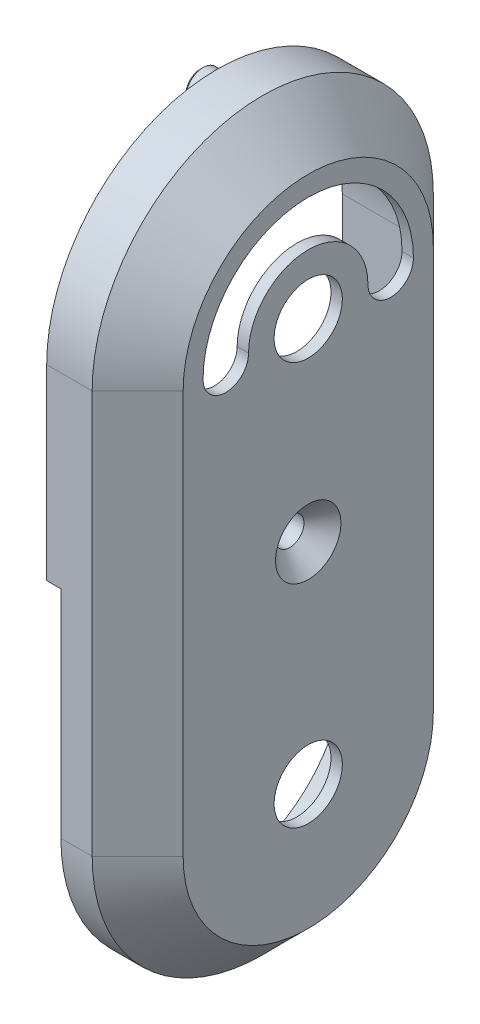
ISO-10303-21;
HEADER;
FILE_DESCRIPTION(('STEP AP214'),'2;1');
FILE_NAME('part.step','',(''),(''),'','','');
FILE_SCHEMA(('AUTOMOTIVE_DESIGN { 1 0 10303 214 1 1 1 1 }'));
ENDSEC;
DATA;
#1=APPLICATION_CONTEXT('core data for automotive mechanical design processes');
#2=APPLICATION_PROTOCOL_DEFINITION('international standard','automotive_design',2000,#1);
#3=PRODUCT_CONTEXT('',#1,'mechanical');
#4=PRODUCT('Part','Part','',(#3));
#5=PRODUCT_RELATED_PRODUCT_CATEGORY('part','',(#4));
#6=PRODUCT_DEFINITION_FORMATION('','',#4);
#7=PRODUCT_DEFINITION_CONTEXT('part definition',#1,'design');
#8=PRODUCT_DEFINITION('design','',#6,#7);
#9=PRODUCT_DEFINITION_SHAPE('','',#8);
#10=(LENGTH_UNIT() NAMED_UNIT(*) SI_UNIT(.MILLI.,.METRE.));
#11=(NAMED_UNIT(*) PLANE_ANGLE_UNIT() SI_UNIT($,.RADIAN.));
#12=(NAMED_UNIT(*) SI_UNIT($,.STERADIAN.) SOLID_ANGLE_UNIT());
#13=UNCERTAINTY_MEASURE_WITH_UNIT(LENGTH_MEASURE(1.E-05),#10,'distance_accuracy_value','');
#14=(GEOMETRIC_REPRESENTATION_CONTEXT(3) GLOBAL_UNCERTAINTY_ASSIGNED_CONTEXT((#13)) GLOBAL_UNIT_ASSIGNED_CONTEXT((#10,
#11,#12)) REPRESENTATION_CONTEXT('',''));
#15=CARTESIAN_POINT('',(0.,0.,0.));
#16=DIRECTION('',(0.,0.,1.));
#17=DIRECTION('',(1.,0.,0.));
#18=AXIS2_PLACEMENT_3D('',#15,#16,#17);
#19=CARTESIAN_POINT('',(22.75,21.4944371013356,49.5));
#20=DIRECTION('',(-0.707106781186546,0.,0.707106781186549));
#21=DIRECTION('',(0.,1.,0.));
#22=AXIS2_PLACEMENT_3D('',#19,#20,#21);
#23=PLANE('',#22);
#24=DIRECTION('',(0.,-1.,0.));
#25=VECTOR('',#24,1.);
#26=CARTESIAN_POINT('',(22.25,21.4944371013356,49.));
#27=LINE('',#26,#25);
#28=CARTESIAN_POINT('',(22.25,-9.48074103959939,49.));
#29=VERTEX_POINT('',#28);
#30=CARTESIAN_POINT('',(22.25,-27.4807410395994,49.));
#31=VERTEX_POINT('',#30);
#32=EDGE_CURVE('E531',#29,#31,#27,.T.);
#33=ORIENTED_EDGE('',*,*,#32,.T.);
#34=DIRECTION('',(0.707106781186552,0.,0.707106781186543));
#35=VECTOR('',#34,1.);
#36=CARTESIAN_POINT('',(22.25,-27.4807410395994,49.));
#37=LINE('',#36,#35);
#38=CARTESIAN_POINT('',(23.25,-27.4807410395994,50.));
#39=VERTEX_POINT('',#38);
#40=EDGE_CURVE('E11',#31,#39,#37,.T.);
#41=ORIENTED_EDGE('',*,*,#40,.T.);
#42=DIRECTION('',(0.,1.,0.));
#43=VECTOR('',#42,1.);
#44=CARTESIAN_POINT('',(23.25,45.7320261718032,50.));
#45=LINE('',#44,#43);
#46=CARTESIAN_POINT('',(23.25,-8.4807410395994,50.));
#47=VERTEX_POINT('',#46);
#48=EDGE_CURVE('E462',#39,#47,#45,.T.);
#49=ORIENTED_EDGE('',*,*,#48,.T.);
#50=DIRECTION('',(-0.577350269189628,-0.577350269189624,-0.577350269189625));
#51=VECTOR('',#50,1.);
#52=CARTESIAN_POINT('',(23.7041963568225,-8.02654468277692,50.4541963568225));
#53=LINE('',#52,#51);
#54=EDGE_CURVE('E383',#47,#29,#53,.T.);
#55=ORIENTED_EDGE('',*,*,#54,.T.);
#56=EDGE_LOOP('',(#33,#41,#49,#55));
#57=FACE_BOUND('',#56,.T.);
#58=ADVANCED_FACE('F51',(#57),#23,.T.);
#59=CARTESIAN_POINT('',(22.75,-27.4807410395994,35.));
#60=DIRECTION('',(1.,0.,0.));
#61=DIRECTION('',(0.,-1.,0.));
#62=AXIS2_PLACEMENT_3D('',#59,#60,#61);
#63=CONICAL_SURFACE('',#62,14.5,0.785398163397446);
#64=DIRECTION('',(0.707106781186549,0.,-0.707106781186546));
#65=VECTOR('',#64,1.);
#66=CARTESIAN_POINT('',(22.25,-27.4807410395994,21.));
#67=LINE('',#66,#65);
#68=CARTESIAN_POINT('',(22.25,-27.4807410395994,21.));
#69=VERTEX_POINT('',#68);
#70=CARTESIAN_POINT('',(23.25,-27.4807410395994,20.));
#71=VERTEX_POINT('',#70);
#72=EDGE_CURVE('E58',#69,#71,#67,.T.);
#73=ORIENTED_EDGE('',*,*,#72,.T.);
#74=CARTESIAN_POINT('',(23.25,-27.4807410395994,35.));
#75=DIRECTION('',(-1.,0.,0.));
#76=DIRECTION('',(0.,-1.,0.));
#77=AXIS2_PLACEMENT_3D('',#74,#75,#76);
#78=CIRCLE('',#77,15.);
#79=EDGE_CURVE('E516',#71,#39,#78,.T.);
#80=ORIENTED_EDGE('',*,*,#79,.T.);
#81=ORIENTED_EDGE('',*,*,#40,.F.);
#82=CARTESIAN_POINT('',(22.25,-27.4807410395994,35.));
#83=DIRECTION('',(1.,0.,0.));
#84=DIRECTION('',(0.,-1.,0.));
#85=AXIS2_PLACEMENT_3D('',#82,#83,#84);
#86=CIRCLE('',#85,14.);
#87=EDGE_CURVE('E533',#31,#69,#86,.T.);
#88=ORIENTED_EDGE('',*,*,#87,.T.);
#89=EDGE_LOOP('',(#73,#80,#81,#88));
#90=FACE_BOUND('',#89,.T.);
#91=ADVANCED_FACE('F52',(#90),#63,.T.);
#92=CARTESIAN_POINT('',(22.75,-27.2307410395994,20.5));
#93=DIRECTION('',(-0.707106781186548,0.,-0.707106781186548));
#94=DIRECTION('',(-0.707106781186548,0.,0.707106781186548));
#95=AXIS2_PLACEMENT_3D('',#92,#93,#94);
#96=PLANE('',#95);
#97=DIRECTION('',(0.,-1.,0.));
#98=VECTOR('',#97,1.);
#99=CARTESIAN_POINT('',(23.25,-27.3557410395994,20.));
#100=LINE('',#99,#98);
#101=CARTESIAN_POINT('',(23.25,-8.48074103959941,20.));
#102=VERTEX_POINT('',#101);
#103=EDGE_CURVE('E484',#102,#71,#100,.T.);
#104=ORIENTED_EDGE('',*,*,#103,.T.);
#105=ORIENTED_EDGE('',*,*,#72,.F.);
#106=DIRECTION('',(0.,1.,0.));
#107=VECTOR('',#106,1.);
#108=CARTESIAN_POINT('',(22.25,-27.2307410395994,21.));
#109=LINE('',#108,#107);
#110=CARTESIAN_POINT('',(22.25,-9.48074103959942,21.));
#111=VERTEX_POINT('',#110);
#112=EDGE_CURVE('E526',#69,#111,#109,.T.);
#113=ORIENTED_EDGE('',*,*,#112,.T.);
#114=DIRECTION('',(-0.577350269189626,-0.577350269189625,0.577350269189626));
#115=VECTOR('',#114,1.);
#116=CARTESIAN_POINT('',(15.5833333333333,-16.1474077062661,27.6666666666667));
#117=LINE('',#116,#115);
#118=EDGE_CURVE('E497',#102,#111,#117,.T.);
#119=ORIENTED_EDGE('',*,*,#118,.F.);
#120=EDGE_LOOP('',(#104,#105,#113,#119));
#121=FACE_BOUND('',#120,.T.);
#122=ADVANCED_FACE('F677',(#121),#96,.T.);
#123=CARTESIAN_POINT('',(22.25,-26.9807410395994,35.));
#124=DIRECTION('',(1.,0.,0.));
#125=DIRECTION('',(0.,1.,0.));
#126=AXIS2_PLACEMENT_3D('',#123,#124,#125);
#127=PLANE('',#126);
#128=DIRECTION('',(0.,1.,0.));
#129=VECTOR('',#128,1.);
#130=CARTESIAN_POINT('',(22.25,-27.2307410395994,24.));
#131=LINE('',#130,#129);
#132=CARTESIAN_POINT('',(22.25,-27.4807410395994,24.));
#133=VERTEX_POINT('',#132);
#134=CARTESIAN_POINT('',(22.25,-11.4807410395994,24.));
#135=VERTEX_POINT('',#134);
#136=EDGE_CURVE('E408',#133,#135,#131,.T.);
#137=ORIENTED_EDGE('',*,*,#136,.T.);
#138=DIRECTION('',(0.,0.,1.));
#139=VECTOR('',#138,1.);
#140=CARTESIAN_POINT('',(22.25,-11.4807410395994,50.));
#141=LINE('',#140,#139);
#142=CARTESIAN_POINT('',(22.25,-11.4807410395994,23.));
#143=VERTEX_POINT('',#142);
#144=EDGE_CURVE('E486',#143,#135,#141,.T.);
#145=ORIENTED_EDGE('',*,*,#144,.F.);
#146=DIRECTION('',(0.,-0.707106781186547,0.707106781186548));
#147=VECTOR('',#146,1.);
#148=CARTESIAN_POINT('',(22.25,-17.6057410395994,29.125));
#149=LINE('',#148,#147);
#150=EDGE_CURVE('E499',#111,#143,#149,.T.);
#151=ORIENTED_EDGE('',*,*,#150,.F.);
#152=ORIENTED_EDGE('',*,*,#112,.F.);
#153=ORIENTED_EDGE('',*,*,#87,.F.);
#154=ORIENTED_EDGE('',*,*,#32,.F.);
#155=DIRECTION('',(0.,-0.707106781186547,-0.707106781186548));
#156=VECTOR('',#155,1.);
#157=CARTESIAN_POINT('',(22.25,-17.6057410395994,40.875));
#158=LINE('',#157,#156);
#159=CARTESIAN_POINT('',(22.25,-11.4807410395994,47.));
#160=VERTEX_POINT('',#159);
#161=EDGE_CURVE('E388',#29,#160,#158,.T.);
#162=ORIENTED_EDGE('',*,*,#161,.T.);
#163=DIRECTION('',(0.,0.,1.));
#164=VECTOR('',#163,1.);
#165=CARTESIAN_POINT('',(22.25,-11.4807410395994,50.));
#166=LINE('',#165,#164);
#167=CARTESIAN_POINT('',(22.25,-11.4807410395994,46.));
#168=VERTEX_POINT('',#167);
#169=EDGE_CURVE('E425',#168,#160,#166,.T.);
#170=ORIENTED_EDGE('',*,*,#169,.F.);
#171=DIRECTION('',(0.,-1.,0.));
#172=VECTOR('',#171,1.);
#173=CARTESIAN_POINT('',(22.25,-9.50556289866436,46.));
#174=LINE('',#173,#172);
#175=CARTESIAN_POINT('',(22.25,-27.4807410395994,46.));
#176=VERTEX_POINT('',#175);
#177=EDGE_CURVE('E442',#168,#176,#174,.T.);
#178=ORIENTED_EDGE('',*,*,#177,.T.);
#179=CARTESIAN_POINT('',(22.25,-27.4807410395994,35.));
#180=DIRECTION('',(1.,0.,0.));
#181=DIRECTION('',(0.,-1.,0.));
#182=AXIS2_PLACEMENT_3D('',#179,#180,#181);
#183=CIRCLE('',#182,11.);
#184=EDGE_CURVE('E432',#176,#133,#183,.T.);
#185=ORIENTED_EDGE('',*,*,#184,.T.);
#186=EDGE_LOOP('',(#137,#145,#151,#152,#153,#154,#162,#170,#178,#185));
#187=FACE_BOUND('',#186,.T.);
#188=ADVANCED_FACE('F577',(#187),#127,.F.);
#189=CARTESIAN_POINT('',(28.,7.96961524227068,35.));
#190=DIRECTION('',(-1.,0.,0.));
#191=DIRECTION('',(0.,1.,0.));
#192=AXIS2_PLACEMENT_3D('',#189,#190,#191);
#193=CONICAL_SURFACE('',#192,13.,0.785398163397448);
#194=DIRECTION('',(0.707106781186547,0.,-0.707106781186548));
#195=VECTOR('',#194,1.);
#196=CARTESIAN_POINT('',(26.,7.96961524227068,50.));
#197=LINE('',#196,#195);
#198=CARTESIAN_POINT('',(26.,7.96961524227068,50.));
#199=VERTEX_POINT('',#198);
#200=CARTESIAN_POINT('',(30.,7.96961524227068,46.));
#201=VERTEX_POINT('',#200);
#202=EDGE_CURVE('E527',#199,#201,#197,.T.);
#203=ORIENTED_EDGE('',*,*,#202,.T.);
#204=CARTESIAN_POINT('',(30.,7.96961524227068,35.));
#205=DIRECTION('',(-1.,0.,0.));
#206=DIRECTION('',(0.,1.,0.));
#207=AXIS2_PLACEMENT_3D('',#204,#205,#206);
#208=CIRCLE('',#207,11.);
#209=CARTESIAN_POINT('',(30.,7.96961524227068,24.));
#210=VERTEX_POINT('',#209);
#211=EDGE_CURVE('E330',#201,#210,#208,.T.);
#212=ORIENTED_EDGE('',*,*,#211,.T.);
#213=DIRECTION('',(-0.707106781186547,0.,-0.707106781186548));
#214=VECTOR('',#213,1.);
#215=CARTESIAN_POINT('',(30.,7.96961524227068,24.));
#216=LINE('',#215,#214);
#217=CARTESIAN_POINT('',(26.,7.96961524227068,20.));
#218=VERTEX_POINT('',#217);
#219=EDGE_CURVE('E306',#210,#218,#216,.T.);
#220=ORIENTED_EDGE('',*,*,#219,.T.);
#221=CARTESIAN_POINT('',(26.,7.96961524227068,35.));
#222=DIRECTION('',(1.,0.,0.));
#223=DIRECTION('',(0.,1.,0.));
#224=AXIS2_PLACEMENT_3D('',#221,#222,#223);
#225=CIRCLE('',#224,15.);
#226=EDGE_CURVE('E511',#218,#199,#225,.T.);
#227=ORIENTED_EDGE('',*,*,#226,.T.);
#228=EDGE_LOOP('',(#203,#212,#220,#227));
#229=FACE_BOUND('',#228,.T.);
#230=ADVANCED_FACE('F653',(#229),#193,.T.);
#231=CARTESIAN_POINT('',(28.,30.1070261718032,48.));
#232=DIRECTION('',(0.707106781186548,0.,0.707106781186547));
#233=DIRECTION('',(0.,-1.,0.));
#234=AXIS2_PLACEMENT_3D('',#231,#232,#233);
#235=PLANE('',#234);
#236=DIRECTION('',(0.707106781186547,0.,-0.707106781186548));
#237=VECTOR('',#236,1.);
#238=CARTESIAN_POINT('',(26.,-27.4807410395994,50.));
#239=LINE('',#238,#237);
#240=CARTESIAN_POINT('',(26.,-27.4807410395994,50.));
#241=VERTEX_POINT('',#240);
#242=CARTESIAN_POINT('',(30.,-27.4807410395994,46.));
#243=VERTEX_POINT('',#242);
#244=EDGE_CURVE('E310',#241,#243,#239,.T.);
#245=ORIENTED_EDGE('',*,*,#244,.T.);
#246=DIRECTION('',(0.,1.,0.));
#247=VECTOR('',#246,1.);
#248=CARTESIAN_POINT('',(30.,30.1070261718032,46.));
#249=LINE('',#248,#247);
#250=EDGE_CURVE('E321',#243,#201,#249,.T.);
#251=ORIENTED_EDGE('',*,*,#250,.T.);
#252=ORIENTED_EDGE('',*,*,#202,.F.);
#253=DIRECTION('',(0.,-1.,0.));
#254=VECTOR('',#253,1.);
#255=CARTESIAN_POINT('',(26.,30.1070261718032,50.));
#256=LINE('',#255,#254);
#257=EDGE_CURVE('E459',#199,#241,#256,.T.);
#258=ORIENTED_EDGE('',*,*,#257,.T.);
#259=EDGE_LOOP('',(#245,#251,#252,#258));
#260=FACE_BOUND('',#259,.T.);
#261=ADVANCED_FACE('F660',(#260),#235,.T.);
#262=CARTESIAN_POINT('',(28.,-27.4807410395994,35.));
#263=DIRECTION('',(-1.,0.,0.));
#264=DIRECTION('',(0.,-1.,0.));
#265=AXIS2_PLACEMENT_3D('',#262,#263,#264);
#266=CONICAL_SURFACE('',#265,13.,0.785398163397448);
#267=DIRECTION('',(0.707106781186548,0.,0.707106781186548));
#268=VECTOR('',#267,1.);
#269=CARTESIAN_POINT('',(26.,-27.4807410395994,20.));
#270=LINE('',#269,#268);
#271=CARTESIAN_POINT('',(26.,-27.4807410395994,20.));
#272=VERTEX_POINT('',#271);
#273=CARTESIAN_POINT('',(30.,-27.4807410395994,24.));
#274=VERTEX_POINT('',#273);
#275=EDGE_CURVE('E293',#272,#274,#270,.T.);
#276=ORIENTED_EDGE('',*,*,#275,.T.);
#277=CARTESIAN_POINT('',(30.,-27.4807410395994,35.));
#278=DIRECTION('',(-1.,0.,0.));
#279=DIRECTION('',(0.,-1.,0.));
#280=AXIS2_PLACEMENT_3D('',#277,#278,#279);
#281=CIRCLE('',#280,11.);
#282=EDGE_CURVE('E296',#274,#243,#281,.T.);
#283=ORIENTED_EDGE('',*,*,#282,.T.);
#284=ORIENTED_EDGE('',*,*,#244,.F.);
#285=CARTESIAN_POINT('',(26.,-27.4807410395994,35.));
#286=DIRECTION('',(1.,0.,0.));
#287=DIRECTION('',(0.,-1.,0.));
#288=AXIS2_PLACEMENT_3D('',#285,#286,#287);
#289=CIRCLE('',#288,15.);
#290=EDGE_CURVE('E302',#241,#272,#289,.T.);
#291=ORIENTED_EDGE('',*,*,#290,.T.);
#292=EDGE_LOOP('',(#276,#283,#284,#291));
#293=FACE_BOUND('',#292,.T.);
#294=ADVANCED_FACE('F299',(#293),#266,.T.);
#295=CARTESIAN_POINT('',(28.,-18.6181519691319,22.));
#296=DIRECTION('',(0.707106781186548,0.,-0.707106781186548));
#297=DIRECTION('',(0.,-1.,0.));
#298=AXIS2_PLACEMENT_3D('',#295,#296,#297);
#299=PLANE('',#298);
#300=ORIENTED_EDGE('',*,*,#219,.F.);
#301=DIRECTION('',(0.,-1.,0.));
#302=VECTOR('',#301,1.);
#303=CARTESIAN_POINT('',(30.,-18.6181519691319,24.));
#304=LINE('',#303,#302);
#305=EDGE_CURVE('E311',#210,#274,#304,.T.);
#306=ORIENTED_EDGE('',*,*,#305,.T.);
#307=ORIENTED_EDGE('',*,*,#275,.F.);
#308=DIRECTION('',(0.,1.,0.));
#309=VECTOR('',#308,1.);
#310=CARTESIAN_POINT('',(26.,-18.6181519691319,20.));
#311=LINE('',#310,#309);
#312=EDGE_CURVE('E434',#272,#218,#311,.T.);
#313=ORIENTED_EDGE('',*,*,#312,.T.);
#314=EDGE_LOOP('',(#300,#306,#307,#313));
#315=FACE_BOUND('',#314,.T.);
#316=ADVANCED_FACE('F315',(#315),#299,.T.);
#317=CARTESIAN_POINT('',(0.,-27.4807410395994,35.));
#318=DIRECTION('',(1.,0.,0.));
#319=DIRECTION('',(0.,-1.,0.));
#320=AXIS2_PLACEMENT_3D('',#317,#318,#319);
#321=CYLINDRICAL_SURFACE('',#320,15.);
#322=ORIENTED_EDGE('',*,*,#79,.F.);
#323=DIRECTION('',(1.,0.,0.));
#324=VECTOR('',#323,1.);
#325=CARTESIAN_POINT('',(0.,-27.4807410395994,20.));
#326=LINE('',#325,#324);
#327=EDGE_CURVE('E433',#71,#272,#326,.T.);
#328=ORIENTED_EDGE('',*,*,#327,.T.);
#329=ORIENTED_EDGE('',*,*,#290,.F.);
#330=DIRECTION('',(-1.,0.,0.));
#331=VECTOR('',#330,1.);
#332=CARTESIAN_POINT('',(0.,-27.4807410395994,50.));
#333=LINE('',#332,#331);
#334=EDGE_CURVE('E456',#241,#39,#333,.T.);
#335=ORIENTED_EDGE('',*,*,#334,.T.);
#336=EDGE_LOOP('',(#322,#328,#329,#335));
#337=FACE_BOUND('',#336,.T.);
#338=ADVANCED_FACE('F662',(#337),#321,.T.);
#339=CARTESIAN_POINT('',(0.,7.96961524227068,35.));
#340=DIRECTION('',(1.,0.,0.));
#341=DIRECTION('',(0.,1.,0.));
#342=AXIS2_PLACEMENT_3D('',#339,#340,#341);
#343=CYLINDRICAL_SURFACE('',#342,15.);
#344=CARTESIAN_POINT('',(22.,7.96961524227068,35.));
#345=DIRECTION('',(1.,0.,0.));
#346=DIRECTION('',(0.,1.,0.));
#347=AXIS2_PLACEMENT_3D('',#344,#345,#346);
#348=CIRCLE('',#347,15.);
#349=CARTESIAN_POINT('',(22.,7.96961524227068,20.));
#350=VERTEX_POINT('',#349);
#351=CARTESIAN_POINT('',(22.,7.96961524227068,50.));
#352=VERTEX_POINT('',#351);
#353=EDGE_CURVE('E351',#350,#352,#348,.T.);
#354=ORIENTED_EDGE('',*,*,#353,.T.);
#355=DIRECTION('',(1.,0.,0.));
#356=VECTOR('',#355,1.);
#357=CARTESIAN_POINT('',(0.,7.96961524227068,50.));
#358=LINE('',#357,#356);
#359=EDGE_CURVE('E508',#352,#199,#358,.T.);
#360=ORIENTED_EDGE('',*,*,#359,.T.);
#361=ORIENTED_EDGE('',*,*,#226,.F.);
#362=DIRECTION('',(1.,0.,0.));
#363=VECTOR('',#362,1.);
#364=CARTESIAN_POINT('',(0.,7.96961524227068,20.));
#365=LINE('',#364,#363);
#366=EDGE_CURVE('E438',#350,#218,#365,.T.);
#367=ORIENTED_EDGE('',*,*,#366,.F.);
#368=EDGE_LOOP('',(#354,#360,#361,#367));
#369=FACE_BOUND('',#368,.T.);
#370=ADVANCED_FACE('F671',(#369),#343,.T.);
#371=CARTESIAN_POINT('',(0.,69.9696152422707,50.));
#372=DIRECTION('',(0.,0.,1.));
#373=DIRECTION('',(0.,-1.,0.));
#374=AXIS2_PLACEMENT_3D('',#371,#372,#373);
#375=PLANE('',#374);
#376=ORIENTED_EDGE('',*,*,#48,.F.);
#377=ORIENTED_EDGE('',*,*,#334,.F.);
#378=ORIENTED_EDGE('',*,*,#257,.F.);
#379=ORIENTED_EDGE('',*,*,#359,.F.);
#380=DIRECTION('',(0.,-1.,0.));
#381=VECTOR('',#380,1.);
#382=CARTESIAN_POINT('',(22.,41.8570261718032,50.));
#383=LINE('',#382,#381);
#384=CARTESIAN_POINT('',(22.,-8.4807410395994,50.));
#385=VERTEX_POINT('',#384);
#386=EDGE_CURVE('E358',#352,#385,#383,.T.);
#387=ORIENTED_EDGE('',*,*,#386,.T.);
#388=DIRECTION('',(-1.,0.,0.));
#389=VECTOR('',#388,1.);
#390=CARTESIAN_POINT('',(0.,-8.4807410395994,50.));
#391=LINE('',#390,#389);
#392=EDGE_CURVE('E386',#47,#385,#391,.T.);
#393=ORIENTED_EDGE('',*,*,#392,.F.);
#394=EDGE_LOOP('',(#376,#377,#378,#379,#387,#393));
#395=FACE_BOUND('',#394,.T.);
#396=ADVANCED_FACE('F672',(#395),#375,.T.);
#397=CARTESIAN_POINT('',(0.,-27.4807410395994,20.));
#398=DIRECTION('',(0.,0.,-1.));
#399=DIRECTION('',(0.,-1.,0.));
#400=AXIS2_PLACEMENT_3D('',#397,#398,#399);
#401=PLANE('',#400);
#402=ORIENTED_EDGE('',*,*,#103,.F.);
#403=DIRECTION('',(1.,0.,0.));
#404=VECTOR('',#403,1.);
#405=CARTESIAN_POINT('',(0.,-8.48074103959941,20.));
#406=LINE('',#405,#404);
#407=CARTESIAN_POINT('',(22.,-8.48074103959941,20.));
#408=VERTEX_POINT('',#407);
#409=EDGE_CURVE('E494',#408,#102,#406,.T.);
#410=ORIENTED_EDGE('',*,*,#409,.F.);
#411=DIRECTION('',(0.,1.,0.));
#412=VECTOR('',#411,1.);
#413=CARTESIAN_POINT('',(22.,-6.86815196913188,20.));
#414=LINE('',#413,#412);
#415=EDGE_CURVE('E360',#408,#350,#414,.T.);
#416=ORIENTED_EDGE('',*,*,#415,.T.);
#417=ORIENTED_EDGE('',*,*,#366,.T.);
#418=ORIENTED_EDGE('',*,*,#312,.F.);
#419=ORIENTED_EDGE('',*,*,#327,.F.);
#420=EDGE_LOOP('',(#402,#410,#416,#417,#418,#419));
#421=FACE_BOUND('',#420,.T.);
#422=ADVANCED_FACE('F670',(#421),#401,.T.);
#423=CARTESIAN_POINT('',(0.,-9.98074103959941,21.5));
#424=DIRECTION('',(0.,-0.707106781186548,-0.707106781186547));
#425=DIRECTION('',(0.,0.707106781186547,-0.707106781186548));
#426=AXIS2_PLACEMENT_3D('',#423,#424,#425);
#427=PLANE('',#426);
#428=DIRECTION('',(0.,0.707106781186547,-0.707106781186548));
#429=VECTOR('',#428,1.);
#430=CARTESIAN_POINT('',(22.,-2.42444650436566,13.9437054647662));
#431=LINE('',#430,#429);
#432=CARTESIAN_POINT('',(22.,-11.4807410395994,23.));
#433=VERTEX_POINT('',#432);
#434=EDGE_CURVE('E474',#433,#408,#431,.T.);
#435=ORIENTED_EDGE('',*,*,#434,.T.);
#436=ORIENTED_EDGE('',*,*,#409,.T.);
#437=ORIENTED_EDGE('',*,*,#118,.T.);
#438=ORIENTED_EDGE('',*,*,#150,.T.);
#439=DIRECTION('',(-1.,0.,0.));
#440=VECTOR('',#439,1.);
#441=CARTESIAN_POINT('',(0.,-11.4807410395994,23.));
#442=LINE('',#441,#440);
#443=EDGE_CURVE('E424',#143,#433,#442,.T.);
#444=ORIENTED_EDGE('',*,*,#443,.T.);
#445=EDGE_LOOP('',(#435,#436,#437,#438,#444));
#446=FACE_BOUND('',#445,.T.);
#447=ADVANCED_FACE('F693',(#446),#427,.T.);
#448=CARTESIAN_POINT('',(0.,-9.9807410395994,48.5));
#449=DIRECTION('',(0.,-0.707106781186548,0.707106781186547));
#450=DIRECTION('',(-1.,0.,0.));
#451=AXIS2_PLACEMENT_3D('',#448,#449,#450);
#452=PLANE('',#451);
#453=DIRECTION('',(0.,-0.707106781186547,-0.707106781186548));
#454=VECTOR('',#453,1.);
#455=CARTESIAN_POINT('',(22.,-12.4244465043656,46.0562945352338));
#456=LINE('',#455,#454);
#457=CARTESIAN_POINT('',(22.,-11.4807410395994,47.));
#458=VERTEX_POINT('',#457);
#459=EDGE_CURVE('E461',#385,#458,#456,.T.);
#460=ORIENTED_EDGE('',*,*,#459,.T.);
#461=DIRECTION('',(1.,0.,0.));
#462=VECTOR('',#461,1.);
#463=CARTESIAN_POINT('',(0.,-11.4807410395994,47.));
#464=LINE('',#463,#462);
#465=EDGE_CURVE('E419',#458,#160,#464,.T.);
#466=ORIENTED_EDGE('',*,*,#465,.T.);
#467=ORIENTED_EDGE('',*,*,#161,.F.);
#468=ORIENTED_EDGE('',*,*,#54,.F.);
#469=ORIENTED_EDGE('',*,*,#392,.T.);
#470=EDGE_LOOP('',(#460,#466,#467,#468,#469));
#471=FACE_BOUND('',#470,.T.);
#472=ADVANCED_FACE('F692',(#471),#452,.T.);
#473=CARTESIAN_POINT('',(0.,-11.4807410395994,20.));
#474=DIRECTION('',(0.,1.,0.));
#475=DIRECTION('',(0.,0.,-1.));
#476=AXIS2_PLACEMENT_3D('',#473,#474,#475);
#477=PLANE('',#476);
#478=DIRECTION('',(-1.,0.,0.));
#479=VECTOR('',#478,1.);
#480=CARTESIAN_POINT('',(11.,-11.4807410395994,24.));
#481=LINE('',#480,#479);
#482=CARTESIAN_POINT('',(22.,-11.4807410395994,24.));
#483=VERTEX_POINT('',#482);
#484=EDGE_CURVE('E347',#135,#483,#481,.T.);
#485=ORIENTED_EDGE('',*,*,#484,.T.);
#486=DIRECTION('',(0.,0.,-1.));
#487=VECTOR('',#486,1.);
#488=CARTESIAN_POINT('',(22.,-11.4807410395994,17.5));
#489=LINE('',#488,#487);
#490=EDGE_CURVE('E473',#483,#433,#489,.T.);
#491=ORIENTED_EDGE('',*,*,#490,.T.);
#492=ORIENTED_EDGE('',*,*,#443,.F.);
#493=ORIENTED_EDGE('',*,*,#144,.T.);
#494=EDGE_LOOP('',(#485,#491,#492,#493));
#495=FACE_BOUND('',#494,.T.);
#496=ADVANCED_FACE('F770',(#495),#477,.F.);
#497=CARTESIAN_POINT('',(0.,-11.4807410395994,20.));
#498=DIRECTION('',(0.,1.,0.));
#499=DIRECTION('',(0.,0.,-1.));
#500=AXIS2_PLACEMENT_3D('',#497,#498,#499);
#501=PLANE('',#500);
#502=DIRECTION('',(1.,0.,0.));
#503=VECTOR('',#502,1.);
#504=CARTESIAN_POINT('',(11.,-11.4807410395994,46.));
#505=LINE('',#504,#503);
#506=CARTESIAN_POINT('',(22.,-11.4807410395994,46.));
#507=VERTEX_POINT('',#506);
#508=EDGE_CURVE('E448',#507,#168,#505,.T.);
#509=ORIENTED_EDGE('',*,*,#508,.T.);
#510=ORIENTED_EDGE('',*,*,#169,.T.);
#511=ORIENTED_EDGE('',*,*,#465,.F.);
#512=DIRECTION('',(0.,0.,-1.));
#513=VECTOR('',#512,1.);
#514=CARTESIAN_POINT('',(22.,-11.4807410395994,17.5));
#515=LINE('',#514,#513);
#516=EDGE_CURVE('E441',#458,#507,#515,.T.);
#517=ORIENTED_EDGE('',*,*,#516,.T.);
#518=EDGE_LOOP('',(#509,#510,#511,#517));
#519=FACE_BOUND('',#518,.T.);
#520=ADVANCED_FACE('F774',(#519),#501,.F.);
#521=CARTESIAN_POINT('',(22.,13.7444371013356,15.));
#522=DIRECTION('',(1.,0.,0.));
#523=DIRECTION('',(0.,1.,0.));
#524=AXIS2_PLACEMENT_3D('',#521,#522,#523);
#525=PLANE('',#524);
#526=CARTESIAN_POINT('',(22.,20.9696152422707,35.));
#527=DIRECTION('',(1.,0.,0.));
#528=DIRECTION('',(0.,1.,0.));
#529=AXIS2_PLACEMENT_3D('',#526,#527,#528);
#530=CIRCLE('',#529,1.5);
#531=CARTESIAN_POINT('',(22.,19.4696152422707,35.));
#532=VERTEX_POINT('',#531);
#533=EDGE_CURVE('E596',#532,#532,#530,.T.);
#534=ORIENTED_EDGE('',*,*,#533,.T.);
#535=EDGE_LOOP('',(#534));
#536=FACE_BOUND('',#535,.T.);
#537=DIRECTION('',(0.,1.,0.));
#538=VECTOR('',#537,1.);
#539=CARTESIAN_POINT('',(22.,-6.86815196913188,24.));
#540=LINE('',#539,#538);
#541=CARTESIAN_POINT('',(22.,7.96961524227068,24.));
#542=VERTEX_POINT('',#541);
#543=EDGE_CURVE('E345',#483,#542,#540,.T.);
#544=ORIENTED_EDGE('',*,*,#543,.T.);
#545=CARTESIAN_POINT('',(22.,7.96961524227069,35.));
#546=DIRECTION('',(1.,0.,0.));
#547=DIRECTION('',(0.,-1.,0.));
#548=AXIS2_PLACEMENT_3D('',#545,#546,#547);
#549=CIRCLE('',#548,11.);
#550=CARTESIAN_POINT('',(22.,7.96961524227069,46.));
#551=VERTEX_POINT('',#550);
#552=EDGE_CURVE('E439',#542,#551,#549,.T.);
#553=ORIENTED_EDGE('',*,*,#552,.T.);
#554=DIRECTION('',(0.,-1.,0.));
#555=VECTOR('',#554,1.);
#556=CARTESIAN_POINT('',(22.,10.8570261718032,46.));
#557=LINE('',#556,#555);
#558=EDGE_CURVE('E455',#551,#507,#557,.T.);
#559=ORIENTED_EDGE('',*,*,#558,.T.);
#560=ORIENTED_EDGE('',*,*,#516,.F.);
#561=ORIENTED_EDGE('',*,*,#459,.F.);
#562=ORIENTED_EDGE('',*,*,#386,.F.);
#563=ORIENTED_EDGE('',*,*,#353,.F.);
#564=ORIENTED_EDGE('',*,*,#415,.F.);
#565=ORIENTED_EDGE('',*,*,#434,.F.);
#566=ORIENTED_EDGE('',*,*,#490,.F.);
#567=EDGE_LOOP('',(#544,#553,#559,#560,#561,#562,#563,#564,#565,#566));
#568=FACE_BOUND('',#567,.T.);
#569=ADVANCED_FACE('F785',(#536,#568),#525,.F.);
#570=CARTESIAN_POINT('',(22.,7.96961524227069,35.));
#571=DIRECTION('',(1.,0.,0.));
#572=DIRECTION('',(0.,1.,0.));
#573=AXIS2_PLACEMENT_3D('',#570,#571,#572);
#574=CYLINDRICAL_SURFACE('',#573,11.);
#575=ORIENTED_EDGE('',*,*,#552,.F.);
#576=DIRECTION('',(1.,0.,0.));
#577=VECTOR('',#576,1.);
#578=CARTESIAN_POINT('',(22.,7.96961524227068,24.));
#579=LINE('',#578,#577);
#580=CARTESIAN_POINT('',(29.,7.96961524227068,24.));
#581=VERTEX_POINT('',#580);
#582=EDGE_CURVE('E346',#542,#581,#579,.T.);
#583=ORIENTED_EDGE('',*,*,#582,.T.);
#584=CARTESIAN_POINT('',(29.,7.96961524227069,35.));
#585=DIRECTION('',(1.,0.,0.));
#586=DIRECTION('',(0.,-1.,0.));
#587=AXIS2_PLACEMENT_3D('',#584,#585,#586);
#588=CIRCLE('',#587,11.);
#589=CARTESIAN_POINT('',(29.,7.96961524227069,46.));
#590=VERTEX_POINT('',#589);
#591=EDGE_CURVE('E367',#581,#590,#588,.T.);
#592=ORIENTED_EDGE('',*,*,#591,.T.);
#593=DIRECTION('',(1.,0.,0.));
#594=VECTOR('',#593,1.);
#595=CARTESIAN_POINT('',(22.,7.96961524227069,46.));
#596=LINE('',#595,#594);
#597=EDGE_CURVE('E444',#551,#590,#596,.T.);
#598=ORIENTED_EDGE('',*,*,#597,.F.);
#599=EDGE_LOOP('',(#575,#583,#592,#598));
#600=FACE_BOUND('',#599,.T.);
#601=ADVANCED_FACE('F794',(#600),#574,.F.);
#602=CARTESIAN_POINT('',(22.,7.96961524227069,46.));
#603=DIRECTION('',(0.,0.,1.));
#604=DIRECTION('',(1.,0.,0.));
#605=AXIS2_PLACEMENT_3D('',#602,#603,#604);
#606=PLANE('',#605);
#607=ORIENTED_EDGE('',*,*,#177,.F.);
#608=ORIENTED_EDGE('',*,*,#508,.F.);
#609=ORIENTED_EDGE('',*,*,#558,.F.);
#610=ORIENTED_EDGE('',*,*,#597,.T.);
#611=DIRECTION('',(0.,-1.,0.));
#612=VECTOR('',#611,1.);
#613=CARTESIAN_POINT('',(29.,7.96961524227069,46.));
#614=LINE('',#613,#612);
#615=CARTESIAN_POINT('',(29.,-27.4807410395994,46.));
#616=VERTEX_POINT('',#615);
#617=EDGE_CURVE('E382',#590,#616,#614,.T.);
#618=ORIENTED_EDGE('',*,*,#617,.T.);
#619=DIRECTION('',(1.,0.,0.));
#620=VECTOR('',#619,1.);
#621=CARTESIAN_POINT('',(22.,-27.4807410395994,46.));
#622=LINE('',#621,#620);
#623=EDGE_CURVE('E440',#176,#616,#622,.T.);
#624=ORIENTED_EDGE('',*,*,#623,.F.);
#625=EDGE_LOOP('',(#607,#608,#609,#610,#618,#624));
#626=FACE_BOUND('',#625,.T.);
#627=ADVANCED_FACE('F586',(#626),#606,.F.);
#628=CARTESIAN_POINT('',(22.,-27.4807410395994,35.));
#629=DIRECTION('',(1.,0.,0.));
#630=DIRECTION('',(0.,-1.,0.));
#631=AXIS2_PLACEMENT_3D('',#628,#629,#630);
#632=CYLINDRICAL_SURFACE('',#631,11.);
#633=ORIENTED_EDGE('',*,*,#184,.F.);
#634=ORIENTED_EDGE('',*,*,#623,.T.);
#635=CARTESIAN_POINT('',(29.,-27.4807410395994,35.));
#636=DIRECTION('',(1.,0.,0.));
#637=DIRECTION('',(0.,-1.,0.));
#638=AXIS2_PLACEMENT_3D('',#635,#636,#637);
#639=CIRCLE('',#638,11.);
#640=CARTESIAN_POINT('',(29.,-27.4807410395994,24.));
#641=VERTEX_POINT('',#640);
#642=EDGE_CURVE('E378',#616,#641,#639,.T.);
#643=ORIENTED_EDGE('',*,*,#642,.T.);
#644=DIRECTION('',(1.,0.,0.));
#645=VECTOR('',#644,1.);
#646=CARTESIAN_POINT('',(22.,-27.4807410395994,24.));
#647=LINE('',#646,#645);
#648=EDGE_CURVE('E415',#133,#641,#647,.T.);
#649=ORIENTED_EDGE('',*,*,#648,.F.);
#650=EDGE_LOOP('',(#633,#634,#643,#649));
#651=FACE_BOUND('',#650,.T.);
#652=ADVANCED_FACE('F567',(#651),#632,.F.);
#653=CARTESIAN_POINT('',(22.,-27.4807410395994,24.));
#654=DIRECTION('',(0.,0.,-1.));
#655=DIRECTION('',(0.,-1.,0.));
#656=AXIS2_PLACEMENT_3D('',#653,#654,#655);
#657=PLANE('',#656);
#658=ORIENTED_EDGE('',*,*,#136,.F.);
#659=ORIENTED_EDGE('',*,*,#648,.T.);
#660=DIRECTION('',(0.,1.,0.));
#661=VECTOR('',#660,1.);
#662=CARTESIAN_POINT('',(29.,-27.4807410395994,24.));
#663=LINE('',#662,#661);
#664=EDGE_CURVE('E377',#641,#581,#663,.T.);
#665=ORIENTED_EDGE('',*,*,#664,.T.);
#666=ORIENTED_EDGE('',*,*,#582,.F.);
#667=ORIENTED_EDGE('',*,*,#543,.F.);
#668=ORIENTED_EDGE('',*,*,#484,.F.);
#669=EDGE_LOOP('',(#658,#659,#665,#666,#667,#668));
#670=FACE_BOUND('',#669,.T.);
#671=ADVANCED_FACE('F574',(#670),#657,.F.);
#672=CARTESIAN_POINT('',(30.,7.96961524227068,27.75));
#673=DIRECTION('',(-1.,0.,0.));
#674=DIRECTION('',(0.,-1.,0.));
#675=AXIS2_PLACEMENT_3D('',#672,#673,#674);
#676=CYLINDRICAL_SURFACE('',#675,2.);
#677=CARTESIAN_POINT('',(30.,7.96961524227068,27.75));
#678=DIRECTION('',(-1.,0.,0.));
#679=DIRECTION('',(0.,1.,0.));
#680=AXIS2_PLACEMENT_3D('',#677,#678,#679);
#681=CIRCLE('',#680,2.);
#682=CARTESIAN_POINT('',(30.,7.96961524227068,25.75));
#683=VERTEX_POINT('',#682);
#684=CARTESIAN_POINT('',(30.,7.96961524227068,29.75));
#685=VERTEX_POINT('',#684);
#686=EDGE_CURVE('E331',#683,#685,#681,.T.);
#687=ORIENTED_EDGE('',*,*,#686,.F.);
#688=DIRECTION('',(-1.,0.,0.));
#689=VECTOR('',#688,1.);
#690=CARTESIAN_POINT('',(30.,7.96961524227068,25.75));
#691=LINE('',#690,#689);
#692=CARTESIAN_POINT('',(29.,7.96961524227068,25.75));
#693=VERTEX_POINT('',#692);
#694=EDGE_CURVE('E402',#683,#693,#691,.T.);
#695=ORIENTED_EDGE('',*,*,#694,.T.);
#696=CARTESIAN_POINT('',(29.,7.96961524227068,27.75));
#697=DIRECTION('',(1.,0.,0.));
#698=DIRECTION('',(0.,1.,0.));
#699=AXIS2_PLACEMENT_3D('',#696,#697,#698);
#700=CIRCLE('',#699,2.);
#701=CARTESIAN_POINT('',(29.,7.96961524227068,29.75));
#702=VERTEX_POINT('',#701);
#703=EDGE_CURVE('E375',#702,#693,#700,.T.);
#704=ORIENTED_EDGE('',*,*,#703,.F.);
#705=DIRECTION('',(-1.,0.,0.));
#706=VECTOR('',#705,1.);
#707=CARTESIAN_POINT('',(30.,7.96961524227068,29.75));
#708=LINE('',#707,#706);
#709=EDGE_CURVE('E412',#685,#702,#708,.T.);
#710=ORIENTED_EDGE('',*,*,#709,.F.);
#711=EDGE_LOOP('',(#687,#695,#704,#710));
#712=FACE_BOUND('',#711,.T.);
#713=ADVANCED_FACE('F824',(#712),#676,.F.);
#714=CARTESIAN_POINT('',(30.,7.96961524227068,35.));
#715=DIRECTION('',(-1.,0.,0.));
#716=DIRECTION('',(0.,1.,0.));
#717=AXIS2_PLACEMENT_3D('',#714,#715,#716);
#718=CYLINDRICAL_SURFACE('',#717,5.25);
#719=CARTESIAN_POINT('',(30.,7.96961524227068,35.));
#720=DIRECTION('',(1.,0.,0.));
#721=DIRECTION('',(0.,1.,0.));
#722=AXIS2_PLACEMENT_3D('',#719,#720,#721);
#723=CIRCLE('',#722,5.25);
#724=CARTESIAN_POINT('',(30.,7.96961524227068,40.25));
#725=VERTEX_POINT('',#724);
#726=EDGE_CURVE('E336',#685,#725,#723,.T.);
#727=ORIENTED_EDGE('',*,*,#726,.F.);
#728=ORIENTED_EDGE('',*,*,#709,.T.);
#729=CARTESIAN_POINT('',(29.,7.96961524227068,35.));
#730=DIRECTION('',(-1.,0.,0.));
#731=DIRECTION('',(0.,1.,0.));
#732=AXIS2_PLACEMENT_3D('',#729,#730,#731);
#733=CIRCLE('',#732,5.25);
#734=CARTESIAN_POINT('',(29.,7.96961524227068,40.25));
#735=VERTEX_POINT('',#734);
#736=EDGE_CURVE('E363',#735,#702,#733,.T.);
#737=ORIENTED_EDGE('',*,*,#736,.F.);
#738=DIRECTION('',(-1.,0.,0.));
#739=VECTOR('',#738,1.);
#740=CARTESIAN_POINT('',(30.,7.96961524227068,40.25));
#741=LINE('',#740,#739);
#742=EDGE_CURVE('E410',#725,#735,#741,.T.);
#743=ORIENTED_EDGE('',*,*,#742,.F.);
#744=EDGE_LOOP('',(#727,#728,#737,#743));
#745=FACE_BOUND('',#744,.T.);
#746=ADVANCED_FACE('F832',(#745),#718,.T.);
#747=CARTESIAN_POINT('',(30.,7.96961524227068,42.25));
#748=DIRECTION('',(-1.,0.,0.));
#749=DIRECTION('',(0.,-1.,0.));
#750=AXIS2_PLACEMENT_3D('',#747,#748,#749);
#751=CYLINDRICAL_SURFACE('',#750,2.);
#752=CARTESIAN_POINT('',(30.,7.96961524227068,42.25));
#753=DIRECTION('',(-1.,0.,0.));
#754=DIRECTION('',(0.,1.,0.));
#755=AXIS2_PLACEMENT_3D('',#752,#753,#754);
#756=CIRCLE('',#755,2.);
#757=CARTESIAN_POINT('',(30.,7.96961524227068,44.25));
#758=VERTEX_POINT('',#757);
#759=EDGE_CURVE('E344',#725,#758,#756,.T.);
#760=ORIENTED_EDGE('',*,*,#759,.F.);
#761=ORIENTED_EDGE('',*,*,#742,.T.);
#762=CARTESIAN_POINT('',(29.,7.96961524227068,42.25));
#763=DIRECTION('',(1.,0.,0.));
#764=DIRECTION('',(0.,1.,0.));
#765=AXIS2_PLACEMENT_3D('',#762,#763,#764);
#766=CIRCLE('',#765,2.);
#767=CARTESIAN_POINT('',(29.,7.96961524227068,44.25));
#768=VERTEX_POINT('',#767);
#769=EDGE_CURVE('E357',#768,#735,#766,.T.);
#770=ORIENTED_EDGE('',*,*,#769,.F.);
#771=DIRECTION('',(-1.,0.,0.));
#772=VECTOR('',#771,1.);
#773=CARTESIAN_POINT('',(30.,7.96961524227068,44.25));
#774=LINE('',#773,#772);
#775=EDGE_CURVE('E401',#758,#768,#774,.T.);
#776=ORIENTED_EDGE('',*,*,#775,.F.);
#777=EDGE_LOOP('',(#760,#761,#770,#776));
#778=FACE_BOUND('',#777,.T.);
#779=ADVANCED_FACE('F838',(#778),#751,.F.);
#780=CARTESIAN_POINT('',(30.,7.96961524227068,35.));
#781=DIRECTION('',(-1.,0.,0.));
#782=DIRECTION('',(0.,1.,0.));
#783=AXIS2_PLACEMENT_3D('',#780,#781,#782);
#784=CYLINDRICAL_SURFACE('',#783,9.25);
#785=CARTESIAN_POINT('',(30.,7.96961524227068,35.));
#786=DIRECTION('',(-1.,0.,0.));
#787=DIRECTION('',(0.,1.,0.));
#788=AXIS2_PLACEMENT_3D('',#785,#786,#787);
#789=CIRCLE('',#788,9.25);
#790=EDGE_CURVE('E320',#758,#683,#789,.T.);
#791=ORIENTED_EDGE('',*,*,#790,.F.);
#792=ORIENTED_EDGE('',*,*,#775,.T.);
#793=CARTESIAN_POINT('',(29.,7.96961524227068,35.));
#794=DIRECTION('',(1.,0.,0.));
#795=DIRECTION('',(0.,1.,0.));
#796=AXIS2_PLACEMENT_3D('',#793,#794,#795);
#797=CIRCLE('',#796,9.25);
#798=EDGE_CURVE('E362',#693,#768,#797,.T.);
#799=ORIENTED_EDGE('',*,*,#798,.F.);
#800=ORIENTED_EDGE('',*,*,#694,.F.);
#801=EDGE_LOOP('',(#791,#792,#799,#800));
#802=FACE_BOUND('',#801,.T.);
#803=ADVANCED_FACE('F849',(#802),#784,.F.);
#804=CARTESIAN_POINT('',(30.,7.96961524227068,35.));
#805=DIRECTION('',(-1.,0.,0.));
#806=DIRECTION('',(0.,1.,0.));
#807=AXIS2_PLACEMENT_3D('',#804,#805,#806);
#808=CYLINDRICAL_SURFACE('',#807,3.);
#809=CARTESIAN_POINT('',(30.,7.96961524227068,35.));
#810=DIRECTION('',(-1.,0.,0.));
#811=DIRECTION('',(0.,1.,0.));
#812=AXIS2_PLACEMENT_3D('',#809,#810,#811);
#813=CIRCLE('',#812,3.);
#814=CARTESIAN_POINT('',(30.,4.96961524227068,35.));
#815=VERTEX_POINT('',#814);
#816=EDGE_CURVE('E355',#815,#815,#813,.T.);
#817=ORIENTED_EDGE('',*,*,#816,.F.);
#818=DIRECTION('',(-1.,0.,0.));
#819=VECTOR('',#818,1.);
#820=CARTESIAN_POINT('',(30.,4.96961524227068,35.));
#821=LINE('',#820,#819);
#822=CARTESIAN_POINT('',(29.,4.96961524227068,35.));
#823=VERTEX_POINT('',#822);
#824=EDGE_CURVE('E396',#815,#823,#821,.T.);
#825=ORIENTED_EDGE('',*,*,#824,.T.);
#826=CARTESIAN_POINT('',(29.,7.96961524227068,35.));
#827=DIRECTION('',(1.,0.,0.));
#828=DIRECTION('',(0.,1.,0.));
#829=AXIS2_PLACEMENT_3D('',#826,#827,#828);
#830=CIRCLE('',#829,3.);
#831=EDGE_CURVE('E395',#823,#823,#830,.T.);
#832=ORIENTED_EDGE('',*,*,#831,.F.);
#833=ORIENTED_EDGE('',*,*,#824,.F.);
#834=EDGE_LOOP('',(#817,#825,#832,#833));
#835=FACE_BOUND('',#834,.T.);
#836=ADVANCED_FACE('F858',(#835),#808,.F.);
#837=CARTESIAN_POINT('',(22.05,-9.03038475772932,35.));
#838=DIRECTION('',(1.,0.,0.));
#839=DIRECTION('',(0.,1.,0.));
#840=AXIS2_PLACEMENT_3D('',#837,#838,#839);
#841=PLANE('',#840);
#842=CARTESIAN_POINT('',(22.05,-9.03038475772932,35.));
#843=DIRECTION('',(1.,0.,0.));
#844=DIRECTION('',(0.,1.,0.));
#845=AXIS2_PLACEMENT_3D('',#842,#843,#844);
#846=CIRCLE('',#845,1.25);
#847=CARTESIAN_POINT('',(22.05,-10.2803847577293,35.));
#848=VERTEX_POINT('',#847);
#849=EDGE_CURVE('E613',#848,#848,#846,.T.);
#850=ORIENTED_EDGE('',*,*,#849,.T.);
#851=EDGE_LOOP('',(#850));
#852=FACE_BOUND('',#851,.T.);
#853=CARTESIAN_POINT('',(22.05,-9.03038475772932,35.));
#854=DIRECTION('',(-1.,0.,0.));
#855=DIRECTION('',(0.,1.,0.));
#856=AXIS2_PLACEMENT_3D('',#853,#854,#855);
#857=CIRCLE('',#856,2.);
#858=CARTESIAN_POINT('',(22.05,-7.03038475772932,35.));
#859=VERTEX_POINT('',#858);
#860=EDGE_CURVE('E546',#859,#859,#857,.T.);
#861=ORIENTED_EDGE('',*,*,#860,.T.);
#862=EDGE_LOOP('',(#861));
#863=FACE_BOUND('',#862,.T.);
#864=ADVANCED_FACE('F870',(#852,#863),#841,.F.);
#865=CARTESIAN_POINT('',(29.,-9.75556289866436,35.));
#866=DIRECTION('',(-1.,0.,0.));
#867=DIRECTION('',(0.,0.,1.));
#868=AXIS2_PLACEMENT_3D('',#865,#866,#867);
#869=PLANE('',#868);
#870=CARTESIAN_POINT('',(29.,-9.03038475772932,35.));
#871=DIRECTION('',(-1.,0.,0.));
#872=DIRECTION('',(0.,1.,0.));
#873=AXIS2_PLACEMENT_3D('',#870,#871,#872);
#874=CIRCLE('',#873,5.);
#875=CARTESIAN_POINT('',(29.,-4.03038475772932,35.));
#876=VERTEX_POINT('',#875);
#877=EDGE_CURVE('E555',#876,#876,#874,.T.);
#878=ORIENTED_EDGE('',*,*,#877,.F.);
#879=EDGE_LOOP('',(#878));
#880=FACE_BOUND('',#879,.T.);
#881=ORIENTED_EDGE('',*,*,#831,.T.);
#882=EDGE_LOOP('',(#881));
#883=FACE_BOUND('',#882,.T.);
#884=ORIENTED_EDGE('',*,*,#798,.T.);
#885=ORIENTED_EDGE('',*,*,#769,.T.);
#886=ORIENTED_EDGE('',*,*,#736,.T.);
#887=ORIENTED_EDGE('',*,*,#703,.T.);
#888=EDGE_LOOP('',(#884,#885,#886,#887));
#889=FACE_BOUND('',#888,.T.);
#890=CARTESIAN_POINT('',(29.,-27.4807410395994,35.));
#891=DIRECTION('',(1.,0.,0.));
#892=DIRECTION('',(0.,1.,0.));
#893=AXIS2_PLACEMENT_3D('',#890,#891,#892);
#894=CIRCLE('',#893,3.);
#895=CARTESIAN_POINT('',(29.,-30.4807410395994,35.));
#896=VERTEX_POINT('',#895);
#897=EDGE_CURVE('E637',#896,#896,#894,.T.);
#898=ORIENTED_EDGE('',*,*,#897,.T.);
#899=EDGE_LOOP('',(#898));
#900=FACE_BOUND('',#899,.T.);
#901=ORIENTED_EDGE('',*,*,#591,.F.);
#902=ORIENTED_EDGE('',*,*,#664,.F.);
#903=ORIENTED_EDGE('',*,*,#642,.F.);
#904=ORIENTED_EDGE('',*,*,#617,.F.);
#905=EDGE_LOOP('',(#901,#902,#903,#904));
#906=FACE_BOUND('',#905,.T.);
#907=ADVANCED_FACE('F572',(#880,#883,#889,#900,#906),#869,.T.);
#908=CARTESIAN_POINT('',(30.,-9.75556289866437,35.));
#909=DIRECTION('',(1.,0.,0.));
#910=DIRECTION('',(0.,1.,0.));
#911=AXIS2_PLACEMENT_3D('',#908,#909,#910);
#912=PLANE('',#911);
#913=CARTESIAN_POINT('',(30.,-9.03038475772932,35.));
#914=DIRECTION('',(1.,0.,0.));
#915=DIRECTION('',(0.,1.,0.));
#916=AXIS2_PLACEMENT_3D('',#913,#914,#915);
#917=CIRCLE('',#916,2.875);
#918=CARTESIAN_POINT('',(30.,-11.9053847577293,35.));
#919=VERTEX_POINT('',#918);
#920=EDGE_CURVE('E591',#919,#919,#917,.T.);
#921=ORIENTED_EDGE('',*,*,#920,.F.);
#922=EDGE_LOOP('',(#921));
#923=FACE_BOUND('',#922,.T.);
#924=ORIENTED_EDGE('',*,*,#816,.T.);
#925=EDGE_LOOP('',(#924));
#926=FACE_BOUND('',#925,.T.);
#927=ORIENTED_EDGE('',*,*,#790,.T.);
#928=ORIENTED_EDGE('',*,*,#686,.T.);
#929=ORIENTED_EDGE('',*,*,#726,.T.);
#930=ORIENTED_EDGE('',*,*,#759,.T.);
#931=EDGE_LOOP('',(#927,#928,#929,#930));
#932=FACE_BOUND('',#931,.T.);
#933=CARTESIAN_POINT('',(30.,-27.4807410395994,35.));
#934=DIRECTION('',(-1.,0.,0.));
#935=DIRECTION('',(0.,1.,0.));
#936=AXIS2_PLACEMENT_3D('',#933,#934,#935);
#937=CIRCLE('',#936,3.);
#938=CARTESIAN_POINT('',(30.,-30.4807410395994,35.));
#939=VERTEX_POINT('',#938);
#940=EDGE_CURVE('E624',#939,#939,#937,.T.);
#941=ORIENTED_EDGE('',*,*,#940,.T.);
#942=EDGE_LOOP('',(#941));
#943=FACE_BOUND('',#942,.T.);
#944=ORIENTED_EDGE('',*,*,#211,.F.);
#945=ORIENTED_EDGE('',*,*,#250,.F.);
#946=ORIENTED_EDGE('',*,*,#282,.F.);
#947=ORIENTED_EDGE('',*,*,#305,.F.);
#948=EDGE_LOOP('',(#944,#945,#946,#947));
#949=FACE_BOUND('',#948,.T.);
#950=ADVANCED_FACE('F317',(#923,#926,#932,#943,#949),#912,.T.);
#951=CARTESIAN_POINT('',(29.125,-9.03038475772932,35.));
#952=DIRECTION('',(1.,0.,0.));
#953=DIRECTION('',(0.,1.,0.));
#954=AXIS2_PLACEMENT_3D('',#951,#952,#953);
#955=CONICAL_SURFACE('',#954,2.,0.785398163397449);
#956=ORIENTED_EDGE('',*,*,#920,.T.);
#957=DIRECTION('',(-0.707106781186547,0.707106781186548,0.));
#958=VECTOR('',#957,1.);
#959=CARTESIAN_POINT('',(29.125,-11.0303847577293,35.));
#960=LINE('',#959,#958);
#961=CARTESIAN_POINT('',(28.375,-10.2803847577293,35.));
#962=VERTEX_POINT('',#961);
#963=EDGE_CURVE('E553',#919,#962,#960,.T.);
#964=ORIENTED_EDGE('',*,*,#963,.T.);
#965=CARTESIAN_POINT('',(28.375,-9.03038475772932,35.));
#966=DIRECTION('',(-1.,0.,0.));
#967=DIRECTION('',(0.,1.,0.));
#968=AXIS2_PLACEMENT_3D('',#965,#966,#967);
#969=CIRCLE('',#968,1.25);
#970=EDGE_CURVE('E619',#962,#962,#969,.T.);
#971=ORIENTED_EDGE('',*,*,#970,.T.);
#972=ORIENTED_EDGE('',*,*,#963,.F.);
#973=EDGE_LOOP('',(#956,#964,#971,#972));
#974=FACE_BOUND('',#973,.T.);
#975=ADVANCED_FACE('F895',(#974),#955,.F.);
#976=CARTESIAN_POINT('',(15.9319821511221,-9.03038475772932,35.));
#977=DIRECTION('',(1.,0.,0.));
#978=DIRECTION('',(0.,-1.,0.));
#979=AXIS2_PLACEMENT_3D('',#976,#977,#978);
#980=TOROIDAL_SURFACE('',#979,25.7238246832338,24.5);
#981=ORIENTED_EDGE('',*,*,#860,.F.);
#982=CARTESIAN_POINT('',(15.9319821511221,16.6934399255045,35.));
#983=DIRECTION('',(0.,0.,1.));
#984=DIRECTION('',(0.,1.,0.));
#985=AXIS2_PLACEMENT_3D('',#982,#983,#984);
#986=CIRCLE('',#985,24.5);
#987=EDGE_CURVE('E547',#859,#876,#986,.T.);
#988=ORIENTED_EDGE('',*,*,#987,.T.);
#989=ORIENTED_EDGE('',*,*,#877,.T.);
#990=ORIENTED_EDGE('',*,*,#987,.F.);
#991=EDGE_LOOP('',(#981,#988,#989,#990));
#992=FACE_BOUND('',#991,.T.);
#993=ADVANCED_FACE('F901',(#992),#980,.F.);
#994=CARTESIAN_POINT('',(20.5,20.9696152422707,35.));
#995=DIRECTION('',(1.,0.,0.));
#996=DIRECTION('',(0.,1.,0.));
#997=AXIS2_PLACEMENT_3D('',#994,#995,#996);
#998=PLANE('',#997);
#999=CARTESIAN_POINT('',(20.5,20.9696152422707,35.));
#1000=DIRECTION('',(1.,0.,0.));
#1001=DIRECTION('',(0.,1.,0.));
#1002=AXIS2_PLACEMENT_3D('',#999,#1000,#1001);
#1003=CIRCLE('',#1002,1.25);
#1004=CARTESIAN_POINT('',(20.5,19.7196152422707,35.));
#1005=VERTEX_POINT('',#1004);
#1006=EDGE_CURVE('E612',#1005,#1005,#1003,.T.);
#1007=ORIENTED_EDGE('',*,*,#1006,.F.);
#1008=EDGE_LOOP('',(#1007));
#1009=FACE_BOUND('',#1008,.T.);
#1010=ADVANCED_FACE('F909',(#1009),#998,.F.);
#1011=CARTESIAN_POINT('',(22.,20.9696152422707,35.));
#1012=DIRECTION('',(-1.,0.,0.));
#1013=DIRECTION('',(0.,1.,0.));
#1014=AXIS2_PLACEMENT_3D('',#1011,#1012,#1013);
#1015=CYLINDRICAL_SURFACE('',#1014,1.5);
#1016=CARTESIAN_POINT('',(20.75,20.9696152422707,35.));
#1017=DIRECTION('',(-1.,0.,0.));
#1018=DIRECTION('',(0.,1.,0.));
#1019=AXIS2_PLACEMENT_3D('',#1016,#1017,#1018);
#1020=CIRCLE('',#1019,1.5);
#1021=CARTESIAN_POINT('',(20.75,19.4696152422707,35.));
#1022=VERTEX_POINT('',#1021);
#1023=EDGE_CURVE('E598',#1022,#1022,#1020,.T.);
#1024=ORIENTED_EDGE('',*,*,#1023,.F.);
#1025=DIRECTION('',(1.,0.,0.));
#1026=VECTOR('',#1025,1.);
#1027=CARTESIAN_POINT('',(22.,19.4696152422707,35.));
#1028=LINE('',#1027,#1026);
#1029=EDGE_CURVE('E594',#1022,#532,#1028,.T.);
#1030=ORIENTED_EDGE('',*,*,#1029,.T.);
#1031=ORIENTED_EDGE('',*,*,#533,.F.);
#1032=ORIENTED_EDGE('',*,*,#1029,.F.);
#1033=EDGE_LOOP('',(#1024,#1030,#1031,#1032));
#1034=FACE_BOUND('',#1033,.T.);
#1035=ADVANCED_FACE('F916',(#1034),#1015,.T.);
#1036=CARTESIAN_POINT('',(20.625,20.9696152422707,35.));
#1037=DIRECTION('',(1.,0.,0.));
#1038=DIRECTION('',(0.,1.,0.));
#1039=AXIS2_PLACEMENT_3D('',#1036,#1037,#1038);
#1040=CONICAL_SURFACE('',#1039,1.375,0.785398163397448);
#1041=ORIENTED_EDGE('',*,*,#1006,.T.);
#1042=DIRECTION('',(0.707106781186548,-0.707106781186548,0.));
#1043=VECTOR('',#1042,1.);
#1044=CARTESIAN_POINT('',(20.625,19.5946152422707,35.));
#1045=LINE('',#1044,#1043);
#1046=EDGE_CURVE('E610',#1005,#1022,#1045,.T.);
#1047=ORIENTED_EDGE('',*,*,#1046,.T.);
#1048=ORIENTED_EDGE('',*,*,#1023,.T.);
#1049=ORIENTED_EDGE('',*,*,#1046,.F.);
#1050=EDGE_LOOP('',(#1041,#1047,#1048,#1049));
#1051=FACE_BOUND('',#1050,.T.);
#1052=ADVANCED_FACE('F930',(#1051),#1040,.T.);
#1053=CARTESIAN_POINT('',(30.,-9.03038475772932,35.));
#1054=DIRECTION('',(-1.,0.,0.));
#1055=DIRECTION('',(0.,1.,0.));
#1056=AXIS2_PLACEMENT_3D('',#1053,#1054,#1055);
#1057=CYLINDRICAL_SURFACE('',#1056,1.25);
#1058=ORIENTED_EDGE('',*,*,#970,.F.);
#1059=DIRECTION('',(-1.,0.,0.));
#1060=VECTOR('',#1059,1.);
#1061=CARTESIAN_POINT('',(30.,-10.2803847577293,35.));
#1062=LINE('',#1061,#1060);
#1063=EDGE_CURVE('E618',#962,#848,#1062,.T.);
#1064=ORIENTED_EDGE('',*,*,#1063,.T.);
#1065=ORIENTED_EDGE('',*,*,#849,.F.);
#1066=ORIENTED_EDGE('',*,*,#1063,.F.);
#1067=EDGE_LOOP('',(#1058,#1064,#1065,#1066));
#1068=FACE_BOUND('',#1067,.T.);
#1069=ADVANCED_FACE('F940',(#1068),#1057,.F.);
#1070=CARTESIAN_POINT('',(28.5,-27.4807410395994,35.));
#1071=DIRECTION('',(1.,0.,0.));
#1072=DIRECTION('',(0.,1.,0.));
#1073=AXIS2_PLACEMENT_3D('',#1070,#1071,#1072);
#1074=CYLINDRICAL_SURFACE('',#1073,3.);
#1075=ORIENTED_EDGE('',*,*,#897,.F.);
#1076=DIRECTION('',(1.,0.,0.));
#1077=VECTOR('',#1076,1.);
#1078=CARTESIAN_POINT('',(28.5,-30.4807410395994,35.));
#1079=LINE('',#1078,#1077);
#1080=EDGE_CURVE('E632',#896,#939,#1079,.T.);
#1081=ORIENTED_EDGE('',*,*,#1080,.T.);
#1082=ORIENTED_EDGE('',*,*,#940,.F.);
#1083=ORIENTED_EDGE('',*,*,#1080,.F.);
#1084=EDGE_LOOP('',(#1075,#1081,#1082,#1083));
#1085=FACE_BOUND('',#1084,.T.);
#1086=ADVANCED_FACE('F946',(#1085),#1074,.F.);
#1087=CLOSED_SHELL('',(#58,#91,#122,#188,#230,#261,#294,#316,#338,#370,#396,#422,#447,#472,#496,
#520,#569,#601,#627,#652,#671,#713,#746,#779,#803,#836,#864,#907,#950,#975,#993,#1010,#1035,
#1052,#1069,#1086));
#1088=MANIFOLD_SOLID_BREP('B2',#1087);
#1089=ADVANCED_BREP_SHAPE_REPRESENTATION('',(#18,#1088),#14);
#1090=SHAPE_DEFINITION_REPRESENTATION(#9,#1089);
ENDSEC;
END-ISO-10303-21;
